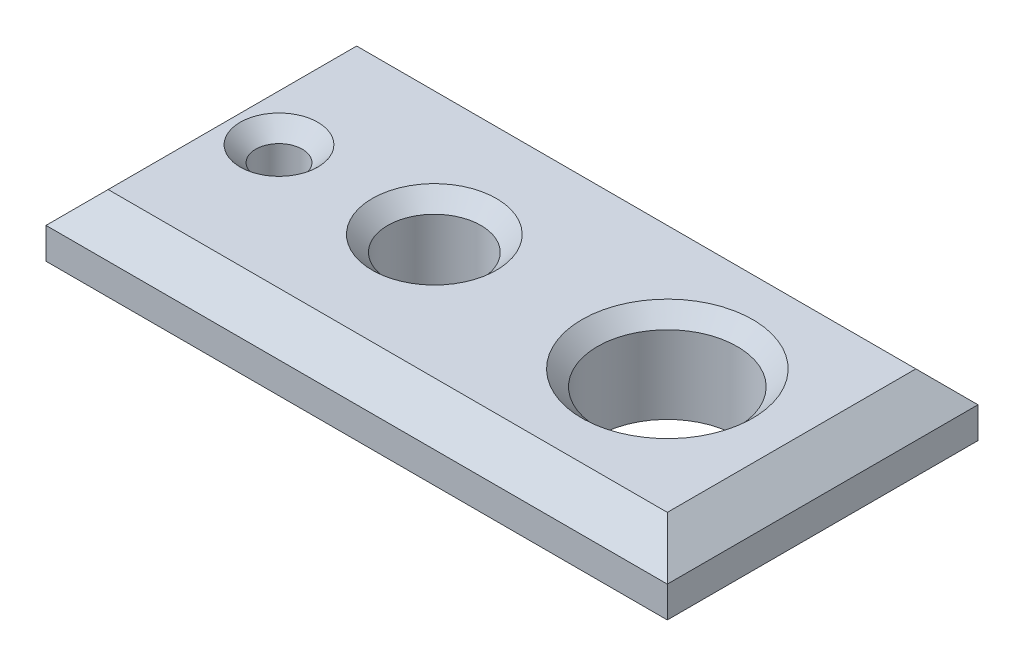
ISO-10303-21;
HEADER;
FILE_DESCRIPTION(('STEP AP214'),'2;1');
FILE_NAME('part.step','',(''),(''),'','','');
FILE_SCHEMA(('AUTOMOTIVE_DESIGN { 1 0 10303 214 1 1 1 1 }'));
ENDSEC;
DATA;
#1=APPLICATION_CONTEXT('core data for automotive mechanical design processes');
#2=APPLICATION_PROTOCOL_DEFINITION('international standard','automotive_design',2000,#1);
#3=PRODUCT_CONTEXT('',#1,'mechanical');
#4=PRODUCT('Part','Part','',(#3));
#5=PRODUCT_RELATED_PRODUCT_CATEGORY('part','',(#4));
#6=PRODUCT_DEFINITION_FORMATION('','',#4);
#7=PRODUCT_DEFINITION_CONTEXT('part definition',#1,'design');
#8=PRODUCT_DEFINITION('design','',#6,#7);
#9=PRODUCT_DEFINITION_SHAPE('','',#8);
#10=(LENGTH_UNIT() NAMED_UNIT(*) SI_UNIT(.MILLI.,.METRE.));
#11=(NAMED_UNIT(*) PLANE_ANGLE_UNIT() SI_UNIT($,.RADIAN.));
#12=(NAMED_UNIT(*) SI_UNIT($,.STERADIAN.) SOLID_ANGLE_UNIT());
#13=UNCERTAINTY_MEASURE_WITH_UNIT(LENGTH_MEASURE(1.E-05),#10,'distance_accuracy_value','');
#14=(GEOMETRIC_REPRESENTATION_CONTEXT(3) GLOBAL_UNCERTAINTY_ASSIGNED_CONTEXT((#13)) GLOBAL_UNIT_ASSIGNED_CONTEXT((#10,
#11,#12)) REPRESENTATION_CONTEXT('',''));
#15=CARTESIAN_POINT('',(0.,0.,0.));
#16=DIRECTION('',(0.,0.,1.));
#17=DIRECTION('',(1.,0.,0.));
#18=AXIS2_PLACEMENT_3D('',#15,#16,#17);
#19=CARTESIAN_POINT('',(-200.,0.,-100.));
#20=DIRECTION('',(0.,-1.,0.));
#21=DIRECTION('',(0.,0.,-1.));
#22=AXIS2_PLACEMENT_3D('',#19,#20,#21);
#23=PLANE('',#22);
#24=CARTESIAN_POINT('',(-175.,0.,-50.));
#25=DIRECTION('',(0.,1.,0.));
#26=DIRECTION('',(-1.,0.,0.));
#27=AXIS2_PLACEMENT_3D('',#24,#25,#26);
#28=CIRCLE('',#27,7.50000000000001);
#29=CARTESIAN_POINT('',(-182.5,0.,-50.));
#30=VERTEX_POINT('',#29);
#31=EDGE_CURVE('E147',#30,#30,#28,.T.);
#32=ORIENTED_EDGE('',*,*,#31,.T.);
#33=EDGE_LOOP('',(#32));
#34=FACE_BOUND('',#33,.T.);
#35=CARTESIAN_POINT('',(-125.,0.,-50.));
#36=DIRECTION('',(0.,1.,0.));
#37=DIRECTION('',(-1.,0.,0.));
#38=AXIS2_PLACEMENT_3D('',#35,#36,#37);
#39=CIRCLE('',#38,15.);
#40=CARTESIAN_POINT('',(-140.,0.,-50.));
#41=VERTEX_POINT('',#40);
#42=EDGE_CURVE('E353',#41,#41,#39,.T.);
#43=ORIENTED_EDGE('',*,*,#42,.T.);
#44=EDGE_LOOP('',(#43));
#45=FACE_BOUND('',#44,.T.);
#46=CARTESIAN_POINT('',(-50.,0.,-50.));
#47=DIRECTION('',(0.,1.,0.));
#48=DIRECTION('',(-1.,0.,0.));
#49=AXIS2_PLACEMENT_3D('',#46,#47,#48);
#50=CIRCLE('',#49,22.5);
#51=CARTESIAN_POINT('',(-72.5000000000001,0.,-50.));
#52=VERTEX_POINT('',#51);
#53=EDGE_CURVE('E357',#52,#52,#50,.T.);
#54=ORIENTED_EDGE('',*,*,#53,.T.);
#55=EDGE_LOOP('',(#54));
#56=FACE_BOUND('',#55,.T.);
#57=DIRECTION('',(0.,0.,-1.));
#58=VECTOR('',#57,1.);
#59=CARTESIAN_POINT('',(-190.,0.,-100.));
#60=LINE('',#59,#58);
#61=CARTESIAN_POINT('',(-190.,0.,-10.));
#62=VERTEX_POINT('',#61);
#63=CARTESIAN_POINT('',(-190.,0.,-90.));
#64=VERTEX_POINT('',#63);
#65=EDGE_CURVE('E335',#62,#64,#60,.T.);
#66=ORIENTED_EDGE('',*,*,#65,.T.);
#67=DIRECTION('',(1.,0.,0.));
#68=VECTOR('',#67,1.);
#69=CARTESIAN_POINT('',(-10.,0.,-90.));
#70=LINE('',#69,#68);
#71=CARTESIAN_POINT('',(-10.,0.,-90.));
#72=VERTEX_POINT('',#71);
#73=EDGE_CURVE('E122',#64,#72,#70,.T.);
#74=ORIENTED_EDGE('',*,*,#73,.T.);
#75=DIRECTION('',(0.,0.,1.));
#76=VECTOR('',#75,1.);
#77=CARTESIAN_POINT('',(-10.,0.,-100.));
#78=LINE('',#77,#76);
#79=CARTESIAN_POINT('',(-10.,0.,-10.));
#80=VERTEX_POINT('',#79);
#81=EDGE_CURVE('E158',#72,#80,#78,.T.);
#82=ORIENTED_EDGE('',*,*,#81,.T.);
#83=DIRECTION('',(-1.,0.,0.));
#84=VECTOR('',#83,1.);
#85=CARTESIAN_POINT('',(-200.,0.,-10.));
#86=LINE('',#85,#84);
#87=EDGE_CURVE('E115',#80,#62,#86,.T.);
#88=ORIENTED_EDGE('',*,*,#87,.T.);
#89=EDGE_LOOP('',(#66,#74,#82,#88));
#90=FACE_BOUND('',#89,.T.);
#91=ADVANCED_FACE('F41',(#34,#45,#56,#90),#23,.T.);
#92=CARTESIAN_POINT('',(-200.,30.,-100.));
#93=DIRECTION('',(-1.,0.,0.));
#94=DIRECTION('',(0.,0.,1.));
#95=AXIS2_PLACEMENT_3D('',#92,#93,#94);
#96=PLANE('',#95);
#97=DIRECTION('',(0.,-1.,0.));
#98=VECTOR('',#97,1.);
#99=CARTESIAN_POINT('',(-200.,30.,-100.));
#100=LINE('',#99,#98);
#101=CARTESIAN_POINT('',(-200.,20.,-100.));
#102=VERTEX_POINT('',#101);
#103=CARTESIAN_POINT('',(-200.,10.,-100.));
#104=VERTEX_POINT('',#103);
#105=EDGE_CURVE('E329',#102,#104,#100,.T.);
#106=ORIENTED_EDGE('',*,*,#105,.T.);
#107=DIRECTION('',(0.,0.,1.));
#108=VECTOR('',#107,1.);
#109=CARTESIAN_POINT('',(-200.,10.,-100.));
#110=LINE('',#109,#108);
#111=CARTESIAN_POINT('',(-200.,10.,0.));
#112=VERTEX_POINT('',#111);
#113=EDGE_CURVE('E156',#104,#112,#110,.T.);
#114=ORIENTED_EDGE('',*,*,#113,.T.);
#115=DIRECTION('',(0.,-1.,0.));
#116=VECTOR('',#115,1.);
#117=CARTESIAN_POINT('',(-200.,30.,0.));
#118=LINE('',#117,#116);
#119=CARTESIAN_POINT('',(-200.,20.,0.));
#120=VERTEX_POINT('',#119);
#121=EDGE_CURVE('E133',#120,#112,#118,.T.);
#122=ORIENTED_EDGE('',*,*,#121,.F.);
#123=DIRECTION('',(0.,0.,-1.));
#124=VECTOR('',#123,1.);
#125=CARTESIAN_POINT('',(-200.,20.,-100.));
#126=LINE('',#125,#124);
#127=EDGE_CURVE('E151',#120,#102,#126,.T.);
#128=ORIENTED_EDGE('',*,*,#127,.T.);
#129=EDGE_LOOP('',(#106,#114,#122,#128));
#130=FACE_BOUND('',#129,.T.);
#131=ADVANCED_FACE('F245',(#130),#96,.T.);
#132=CARTESIAN_POINT('',(0.,30.,-100.));
#133=DIRECTION('',(0.,1.,0.));
#134=DIRECTION('',(-1.,0.,0.));
#135=AXIS2_PLACEMENT_3D('',#132,#133,#134);
#136=PLANE('',#135);
#137=CARTESIAN_POINT('',(-50.0000000000001,30.,-50.));
#138=DIRECTION('',(0.,1.,0.));
#139=DIRECTION('',(-1.,0.,0.));
#140=AXIS2_PLACEMENT_3D('',#137,#138,#139);
#141=CIRCLE('',#140,27.5);
#142=CARTESIAN_POINT('',(-77.5000000000001,30.,-50.));
#143=VERTEX_POINT('',#142);
#144=EDGE_CURVE('E220',#143,#143,#141,.F.);
#145=ORIENTED_EDGE('',*,*,#144,.T.);
#146=EDGE_LOOP('',(#145));
#147=FACE_BOUND('',#146,.T.);
#148=CARTESIAN_POINT('',(-125.,30.,-50.));
#149=DIRECTION('',(0.,1.,0.));
#150=DIRECTION('',(-1.,0.,0.));
#151=AXIS2_PLACEMENT_3D('',#148,#149,#150);
#152=CIRCLE('',#151,19.9999999999999);
#153=CARTESIAN_POINT('',(-145.,30.,-50.));
#154=VERTEX_POINT('',#153);
#155=EDGE_CURVE('E216',#154,#154,#152,.F.);
#156=ORIENTED_EDGE('',*,*,#155,.T.);
#157=EDGE_LOOP('',(#156));
#158=FACE_BOUND('',#157,.T.);
#159=CARTESIAN_POINT('',(-175.,30.,-50.));
#160=DIRECTION('',(0.,1.,0.));
#161=DIRECTION('',(-1.,0.,0.));
#162=AXIS2_PLACEMENT_3D('',#159,#160,#161);
#163=CIRCLE('',#162,12.5);
#164=CARTESIAN_POINT('',(-187.5,30.,-50.));
#165=VERTEX_POINT('',#164);
#166=EDGE_CURVE('E212',#165,#165,#163,.F.);
#167=ORIENTED_EDGE('',*,*,#166,.T.);
#168=EDGE_LOOP('',(#167));
#169=FACE_BOUND('',#168,.T.);
#170=DIRECTION('',(0.,0.,-1.));
#171=VECTOR('',#170,1.);
#172=CARTESIAN_POINT('',(-10.,30.,-100.));
#173=LINE('',#172,#171);
#174=CARTESIAN_POINT('',(-10.,30.,-10.));
#175=VERTEX_POINT('',#174);
#176=CARTESIAN_POINT('',(-10.,30.,-90.));
#177=VERTEX_POINT('',#176);
#178=EDGE_CURVE('E165',#175,#177,#173,.T.);
#179=ORIENTED_EDGE('',*,*,#178,.T.);
#180=DIRECTION('',(-1.,0.,0.));
#181=VECTOR('',#180,1.);
#182=CARTESIAN_POINT('',(-190.,30.,-90.));
#183=LINE('',#182,#181);
#184=CARTESIAN_POINT('',(-190.,30.,-90.));
#185=VERTEX_POINT('',#184);
#186=EDGE_CURVE('E192',#177,#185,#183,.T.);
#187=ORIENTED_EDGE('',*,*,#186,.T.);
#188=DIRECTION('',(0.,0.,1.));
#189=VECTOR('',#188,1.);
#190=CARTESIAN_POINT('',(-190.,30.,-100.));
#191=LINE('',#190,#189);
#192=CARTESIAN_POINT('',(-190.,30.,-10.));
#193=VERTEX_POINT('',#192);
#194=EDGE_CURVE('E168',#185,#193,#191,.T.);
#195=ORIENTED_EDGE('',*,*,#194,.T.);
#196=DIRECTION('',(1.,0.,0.));
#197=VECTOR('',#196,1.);
#198=CARTESIAN_POINT('',(0.,30.,-10.));
#199=LINE('',#198,#197);
#200=EDGE_CURVE('E65',#193,#175,#199,.T.);
#201=ORIENTED_EDGE('',*,*,#200,.T.);
#202=EDGE_LOOP('',(#179,#187,#195,#201));
#203=FACE_BOUND('',#202,.T.);
#204=ADVANCED_FACE('F251',(#147,#158,#169,#203),#136,.T.);
#205=CARTESIAN_POINT('',(0.,0.,-100.));
#206=DIRECTION('',(1.,0.,0.));
#207=DIRECTION('',(0.,0.,-1.));
#208=AXIS2_PLACEMENT_3D('',#205,#206,#207);
#209=PLANE('',#208);
#210=DIRECTION('',(0.,1.,0.));
#211=VECTOR('',#210,1.);
#212=CARTESIAN_POINT('',(0.,0.,0.));
#213=LINE('',#212,#211);
#214=CARTESIAN_POINT('',(0.,10.,0.));
#215=VERTEX_POINT('',#214);
#216=CARTESIAN_POINT('',(0.,20.,0.));
#217=VERTEX_POINT('',#216);
#218=EDGE_CURVE('E130',#215,#217,#213,.T.);
#219=ORIENTED_EDGE('',*,*,#218,.F.);
#220=DIRECTION('',(0.,0.,-1.));
#221=VECTOR('',#220,1.);
#222=CARTESIAN_POINT('',(0.,10.,-100.));
#223=LINE('',#222,#221);
#224=CARTESIAN_POINT('',(0.,10.,-100.));
#225=VERTEX_POINT('',#224);
#226=EDGE_CURVE('E143',#215,#225,#223,.T.);
#227=ORIENTED_EDGE('',*,*,#226,.T.);
#228=DIRECTION('',(0.,1.,0.));
#229=VECTOR('',#228,1.);
#230=CARTESIAN_POINT('',(0.,0.,-100.));
#231=LINE('',#230,#229);
#232=CARTESIAN_POINT('',(0.,20.,-100.));
#233=VERTEX_POINT('',#232);
#234=EDGE_CURVE('E336',#225,#233,#231,.T.);
#235=ORIENTED_EDGE('',*,*,#234,.T.);
#236=DIRECTION('',(0.,0.,1.));
#237=VECTOR('',#236,1.);
#238=CARTESIAN_POINT('',(0.,20.,-100.));
#239=LINE('',#238,#237);
#240=EDGE_CURVE('E145',#233,#217,#239,.T.);
#241=ORIENTED_EDGE('',*,*,#240,.T.);
#242=EDGE_LOOP('',(#219,#227,#235,#241));
#243=FACE_BOUND('',#242,.T.);
#244=ADVANCED_FACE('F141',(#243),#209,.T.);
#245=CARTESIAN_POINT('',(0.,0.,-100.));
#246=DIRECTION('',(0.,0.,1.));
#247=DIRECTION('',(1.,0.,0.));
#248=AXIS2_PLACEMENT_3D('',#245,#246,#247);
#249=PLANE('',#248);
#250=ORIENTED_EDGE('',*,*,#234,.F.);
#251=DIRECTION('',(-1.,0.,0.));
#252=VECTOR('',#251,1.);
#253=CARTESIAN_POINT('',(-190.,10.,-100.));
#254=LINE('',#253,#252);
#255=EDGE_CURVE('E181',#225,#104,#254,.T.);
#256=ORIENTED_EDGE('',*,*,#255,.T.);
#257=ORIENTED_EDGE('',*,*,#105,.F.);
#258=DIRECTION('',(1.,0.,0.));
#259=VECTOR('',#258,1.);
#260=CARTESIAN_POINT('',(-10.,20.,-100.));
#261=LINE('',#260,#259);
#262=EDGE_CURVE('E178',#102,#233,#261,.T.);
#263=ORIENTED_EDGE('',*,*,#262,.T.);
#264=EDGE_LOOP('',(#250,#256,#257,#263));
#265=FACE_BOUND('',#264,.T.);
#266=ADVANCED_FACE('F332',(#265),#249,.F.);
#267=CARTESIAN_POINT('',(0.,0.,0.));
#268=DIRECTION('',(0.,0.,1.));
#269=DIRECTION('',(1.,0.,0.));
#270=AXIS2_PLACEMENT_3D('',#267,#268,#269);
#271=PLANE('',#270);
#272=ORIENTED_EDGE('',*,*,#121,.T.);
#273=DIRECTION('',(1.,0.,0.));
#274=VECTOR('',#273,1.);
#275=CARTESIAN_POINT('',(0.,10.,0.));
#276=LINE('',#275,#274);
#277=EDGE_CURVE('E114',#112,#215,#276,.T.);
#278=ORIENTED_EDGE('',*,*,#277,.T.);
#279=ORIENTED_EDGE('',*,*,#218,.T.);
#280=DIRECTION('',(-1.,0.,0.));
#281=VECTOR('',#280,1.);
#282=CARTESIAN_POINT('',(0.,20.,0.));
#283=LINE('',#282,#281);
#284=EDGE_CURVE('E136',#217,#120,#283,.T.);
#285=ORIENTED_EDGE('',*,*,#284,.T.);
#286=EDGE_LOOP('',(#272,#278,#279,#285));
#287=FACE_BOUND('',#286,.T.);
#288=ADVANCED_FACE('F128',(#287),#271,.T.);
#289=CARTESIAN_POINT('',(-10.,0.,-100.));
#290=DIRECTION('',(-0.707106781186548,0.707106781186547,0.));
#291=DIRECTION('',(0.,0.,1.));
#292=AXIS2_PLACEMENT_3D('',#289,#290,#291);
#293=PLANE('',#292);
#294=ORIENTED_EDGE('',*,*,#81,.F.);
#295=DIRECTION('',(-0.577350269189626,-0.577350269189627,0.577350269189624));
#296=VECTOR('',#295,1.);
#297=CARTESIAN_POINT('',(-6.66666666666669,3.33333333333333,-93.3333333333333));
#298=LINE('',#297,#296);
#299=EDGE_CURVE('E121',#72,#225,#298,.F.);
#300=ORIENTED_EDGE('',*,*,#299,.T.);
#301=ORIENTED_EDGE('',*,*,#226,.F.);
#302=DIRECTION('',(-0.577350269189624,-0.577350269189626,-0.577350269189627));
#303=VECTOR('',#302,1.);
#304=CARTESIAN_POINT('',(-40.,-30.0000000000001,-40.0000000000002));
#305=LINE('',#304,#303);
#306=EDGE_CURVE('E110',#215,#80,#305,.T.);
#307=ORIENTED_EDGE('',*,*,#306,.T.);
#308=EDGE_LOOP('',(#294,#300,#301,#307));
#309=FACE_BOUND('',#308,.T.);
#310=ADVANCED_FACE('F149',(#309),#293,.F.);
#311=CARTESIAN_POINT('',(-200.,10.,-100.));
#312=DIRECTION('',(0.707106781186546,0.707106781186549,0.));
#313=DIRECTION('',(0.,0.,1.));
#314=AXIS2_PLACEMENT_3D('',#311,#312,#313);
#315=PLANE('',#314);
#316=ORIENTED_EDGE('',*,*,#113,.F.);
#317=DIRECTION('',(-0.577350269189628,0.577350269189626,-0.577350269189623));
#318=VECTOR('',#317,1.);
#319=CARTESIAN_POINT('',(-200.,10.,-100.));
#320=LINE('',#319,#318);
#321=EDGE_CURVE('E187',#104,#64,#320,.F.);
#322=ORIENTED_EDGE('',*,*,#321,.T.);
#323=ORIENTED_EDGE('',*,*,#65,.F.);
#324=DIRECTION('',(-0.577350269189626,0.577350269189625,0.577350269189627));
#325=VECTOR('',#324,1.);
#326=CARTESIAN_POINT('',(-166.666666666667,-23.3333333333333,-33.3333333333334));
#327=LINE('',#326,#325);
#328=EDGE_CURVE('E184',#62,#112,#327,.T.);
#329=ORIENTED_EDGE('',*,*,#328,.T.);
#330=EDGE_LOOP('',(#316,#322,#323,#329));
#331=FACE_BOUND('',#330,.T.);
#332=ADVANCED_FACE('F265',(#331),#315,.F.);
#333=CARTESIAN_POINT('',(-190.,30.,-100.));
#334=DIRECTION('',(0.707106781186549,-0.707106781186546,0.));
#335=DIRECTION('',(0.,0.,1.));
#336=AXIS2_PLACEMENT_3D('',#333,#334,#335);
#337=PLANE('',#336);
#338=ORIENTED_EDGE('',*,*,#194,.F.);
#339=DIRECTION('',(0.577350269189625,0.577350269189628,0.577350269189625));
#340=VECTOR('',#339,1.);
#341=CARTESIAN_POINT('',(-193.333333333333,26.6666666666666,-93.3333333333334));
#342=LINE('',#341,#340);
#343=EDGE_CURVE('E199',#185,#102,#342,.F.);
#344=ORIENTED_EDGE('',*,*,#343,.T.);
#345=ORIENTED_EDGE('',*,*,#127,.F.);
#346=DIRECTION('',(0.577350269189623,0.577350269189626,-0.577350269189628));
#347=VECTOR('',#346,1.);
#348=CARTESIAN_POINT('',(-160.,60.0000000000001,-40.0000000000002));
#349=LINE('',#348,#347);
#350=EDGE_CURVE('E196',#120,#193,#349,.T.);
#351=ORIENTED_EDGE('',*,*,#350,.T.);
#352=EDGE_LOOP('',(#338,#344,#345,#351));
#353=FACE_BOUND('',#352,.T.);
#354=ADVANCED_FACE('F271',(#353),#337,.F.);
#355=CARTESIAN_POINT('',(0.,20.,-100.));
#356=DIRECTION('',(-0.707106781186547,-0.707106781186548,0.));
#357=DIRECTION('',(0.,0.,1.));
#358=AXIS2_PLACEMENT_3D('',#355,#356,#357);
#359=PLANE('',#358);
#360=ORIENTED_EDGE('',*,*,#240,.F.);
#361=DIRECTION('',(0.577350269189627,-0.577350269189626,-0.577350269189623));
#362=VECTOR('',#361,1.);
#363=CARTESIAN_POINT('',(0.,20.,-100.));
#364=LINE('',#363,#362);
#365=EDGE_CURVE('E58',#233,#177,#364,.F.);
#366=ORIENTED_EDGE('',*,*,#365,.T.);
#367=ORIENTED_EDGE('',*,*,#178,.F.);
#368=DIRECTION('',(0.577350269189626,-0.577350269189625,0.577350269189627));
#369=VECTOR('',#368,1.);
#370=CARTESIAN_POINT('',(-33.3333333333334,53.3333333333333,-33.3333333333334));
#371=LINE('',#370,#369);
#372=EDGE_CURVE('E202',#175,#217,#371,.T.);
#373=ORIENTED_EDGE('',*,*,#372,.T.);
#374=EDGE_LOOP('',(#360,#366,#367,#373));
#375=FACE_BOUND('',#374,.T.);
#376=ADVANCED_FACE('F278',(#375),#359,.F.);
#377=CARTESIAN_POINT('',(-200.,0.,-90.));
#378=DIRECTION('',(0.,-0.707106781186546,-0.707106781186549));
#379=DIRECTION('',(-1.,0.,0.));
#380=AXIS2_PLACEMENT_3D('',#377,#378,#379);
#381=PLANE('',#380);
#382=ORIENTED_EDGE('',*,*,#321,.F.);
#383=ORIENTED_EDGE('',*,*,#255,.F.);
#384=ORIENTED_EDGE('',*,*,#299,.F.);
#385=ORIENTED_EDGE('',*,*,#73,.F.);
#386=EDGE_LOOP('',(#382,#383,#384,#385));
#387=FACE_BOUND('',#386,.T.);
#388=ADVANCED_FACE('F285',(#387),#381,.T.);
#389=CARTESIAN_POINT('',(0.,30.,-90.));
#390=DIRECTION('',(0.,0.707106781186546,-0.707106781186549));
#391=DIRECTION('',(1.,0.,0.));
#392=AXIS2_PLACEMENT_3D('',#389,#390,#391);
#393=PLANE('',#392);
#394=ORIENTED_EDGE('',*,*,#365,.F.);
#395=ORIENTED_EDGE('',*,*,#262,.F.);
#396=ORIENTED_EDGE('',*,*,#343,.F.);
#397=ORIENTED_EDGE('',*,*,#186,.F.);
#398=EDGE_LOOP('',(#394,#395,#396,#397));
#399=FACE_BOUND('',#398,.T.);
#400=ADVANCED_FACE('F291',(#399),#393,.T.);
#401=CARTESIAN_POINT('',(0.,10.,0.));
#402=DIRECTION('',(0.,0.707106781186549,-0.707106781186546));
#403=DIRECTION('',(1.,0.,0.));
#404=AXIS2_PLACEMENT_3D('',#401,#402,#403);
#405=PLANE('',#404);
#406=ORIENTED_EDGE('',*,*,#328,.F.);
#407=ORIENTED_EDGE('',*,*,#87,.F.);
#408=ORIENTED_EDGE('',*,*,#306,.F.);
#409=ORIENTED_EDGE('',*,*,#277,.F.);
#410=EDGE_LOOP('',(#406,#407,#408,#409));
#411=FACE_BOUND('',#410,.T.);
#412=ADVANCED_FACE('F113',(#411),#405,.F.);
#413=CARTESIAN_POINT('',(0.,20.,0.));
#414=DIRECTION('',(0.,-0.707106781186549,-0.707106781186546));
#415=DIRECTION('',(-1.,0.,0.));
#416=AXIS2_PLACEMENT_3D('',#413,#414,#415);
#417=PLANE('',#416);
#418=ORIENTED_EDGE('',*,*,#372,.F.);
#419=ORIENTED_EDGE('',*,*,#200,.F.);
#420=ORIENTED_EDGE('',*,*,#350,.F.);
#421=ORIENTED_EDGE('',*,*,#284,.F.);
#422=EDGE_LOOP('',(#418,#419,#420,#421));
#423=FACE_BOUND('',#422,.T.);
#424=ADVANCED_FACE('F304',(#423),#417,.F.);
#425=CARTESIAN_POINT('',(-50.,0.,-50.));
#426=DIRECTION('',(0.,1.,0.));
#427=DIRECTION('',(-1.,0.,0.));
#428=AXIS2_PLACEMENT_3D('',#425,#426,#427);
#429=CYLINDRICAL_SURFACE('',#428,22.5);
#430=CARTESIAN_POINT('',(-50.0000000000001,25.,-50.));
#431=DIRECTION('',(0.,1.,0.));
#432=DIRECTION('',(0.,0.,1.));
#433=AXIS2_PLACEMENT_3D('',#430,#431,#432);
#434=CIRCLE('',#433,22.5);
#435=CARTESIAN_POINT('',(-50.0000000000001,25.,-27.5));
#436=VERTEX_POINT('',#435);
#437=EDGE_CURVE('E135',#436,#436,#434,.T.);
#438=ORIENTED_EDGE('',*,*,#437,.T.);
#439=EDGE_LOOP('',(#438));
#440=FACE_BOUND('',#439,.T.);
#441=ORIENTED_EDGE('',*,*,#53,.F.);
#442=EDGE_LOOP('',(#441));
#443=FACE_BOUND('',#442,.T.);
#444=ADVANCED_FACE('F309',(#440,#443),#429,.F.);
#445=CARTESIAN_POINT('',(-125.,0.,-50.));
#446=DIRECTION('',(0.,1.,0.));
#447=DIRECTION('',(-1.,0.,0.));
#448=AXIS2_PLACEMENT_3D('',#445,#446,#447);
#449=CYLINDRICAL_SURFACE('',#448,15.);
#450=CARTESIAN_POINT('',(-125.,25.0000000000001,-50.));
#451=DIRECTION('',(0.,1.,0.));
#452=DIRECTION('',(0.,0.,1.));
#453=AXIS2_PLACEMENT_3D('',#450,#451,#452);
#454=CIRCLE('',#453,15.);
#455=CARTESIAN_POINT('',(-125.,25.0000000000001,-35.));
#456=VERTEX_POINT('',#455);
#457=EDGE_CURVE('E51',#456,#456,#454,.T.);
#458=ORIENTED_EDGE('',*,*,#457,.T.);
#459=EDGE_LOOP('',(#458));
#460=FACE_BOUND('',#459,.T.);
#461=ORIENTED_EDGE('',*,*,#42,.F.);
#462=EDGE_LOOP('',(#461));
#463=FACE_BOUND('',#462,.T.);
#464=ADVANCED_FACE('F227',(#460,#463),#449,.F.);
#465=CARTESIAN_POINT('',(-175.,0.,-50.));
#466=DIRECTION('',(0.,1.,0.));
#467=DIRECTION('',(-1.,0.,0.));
#468=AXIS2_PLACEMENT_3D('',#465,#466,#467);
#469=CYLINDRICAL_SURFACE('',#468,7.50000000000001);
#470=CARTESIAN_POINT('',(-175.,25.,-50.));
#471=DIRECTION('',(0.,1.,0.));
#472=DIRECTION('',(0.,0.,1.));
#473=AXIS2_PLACEMENT_3D('',#470,#471,#472);
#474=CIRCLE('',#473,7.50000000000001);
#475=CARTESIAN_POINT('',(-175.,25.,-42.5));
#476=VERTEX_POINT('',#475);
#477=EDGE_CURVE('E11',#476,#476,#474,.T.);
#478=ORIENTED_EDGE('',*,*,#477,.T.);
#479=EDGE_LOOP('',(#478));
#480=FACE_BOUND('',#479,.T.);
#481=ORIENTED_EDGE('',*,*,#31,.F.);
#482=EDGE_LOOP('',(#481));
#483=FACE_BOUND('',#482,.T.);
#484=ADVANCED_FACE('F239',(#480,#483),#469,.F.);
#485=CARTESIAN_POINT('',(-50.0000000000001,25.,-50.));
#486=DIRECTION('',(0.,1.,0.));
#487=DIRECTION('',(0.,0.,1.));
#488=AXIS2_PLACEMENT_3D('',#485,#486,#487);
#489=CONICAL_SURFACE('',#488,22.5,0.785398163397451);
#490=ORIENTED_EDGE('',*,*,#144,.F.);
#491=EDGE_LOOP('',(#490));
#492=FACE_BOUND('',#491,.T.);
#493=ORIENTED_EDGE('',*,*,#437,.F.);
#494=EDGE_LOOP('',(#493));
#495=FACE_BOUND('',#494,.T.);
#496=ADVANCED_FACE('F232',(#492,#495),#489,.F.);
#497=CARTESIAN_POINT('',(-125.,25.,-50.));
#498=DIRECTION('',(0.,1.,0.));
#499=DIRECTION('',(0.,0.,1.));
#500=AXIS2_PLACEMENT_3D('',#497,#498,#499);
#501=CONICAL_SURFACE('',#500,15.,0.785398163397449);
#502=ORIENTED_EDGE('',*,*,#155,.F.);
#503=EDGE_LOOP('',(#502));
#504=FACE_BOUND('',#503,.T.);
#505=ORIENTED_EDGE('',*,*,#457,.F.);
#506=EDGE_LOOP('',(#505));
#507=FACE_BOUND('',#506,.T.);
#508=ADVANCED_FACE('F230',(#504,#507),#501,.F.);
#509=CARTESIAN_POINT('',(-175.,25.,-50.));
#510=DIRECTION('',(0.,1.,0.));
#511=DIRECTION('',(0.,0.,1.));
#512=AXIS2_PLACEMENT_3D('',#509,#510,#511);
#513=CONICAL_SURFACE('',#512,7.50000000000001,0.785398163397449);
#514=ORIENTED_EDGE('',*,*,#166,.F.);
#515=EDGE_LOOP('',(#514));
#516=FACE_BOUND('',#515,.T.);
#517=ORIENTED_EDGE('',*,*,#477,.F.);
#518=EDGE_LOOP('',(#517));
#519=FACE_BOUND('',#518,.T.);
#520=ADVANCED_FACE('F44',(#516,#519),#513,.F.);
#521=CLOSED_SHELL('',(#91,#131,#204,#244,#266,#288,#310,#332,#354,#376,#388,#400,#412,#424,#444,
#464,#484,#496,#508,#520));
#522=MANIFOLD_SOLID_BREP('B2',#521);
#523=ADVANCED_BREP_SHAPE_REPRESENTATION('',(#18,#522),#14);
#524=SHAPE_DEFINITION_REPRESENTATION(#9,#523);
ENDSEC;
END-ISO-10303-21;
